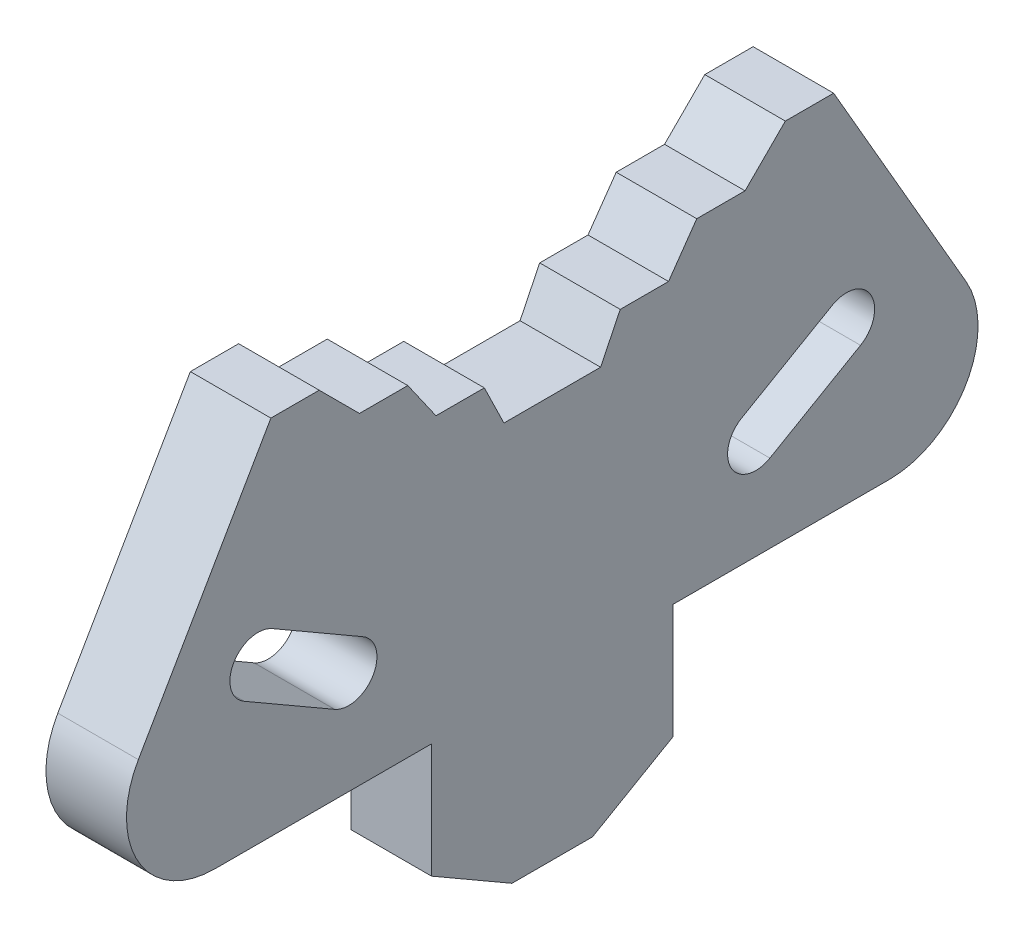
ISO-10303-21;
HEADER;
FILE_DESCRIPTION(('STEP AP214'),'2;1');
FILE_NAME('part.step','',(''),(''),'','','');
FILE_SCHEMA(('AUTOMOTIVE_DESIGN { 1 0 10303 214 1 1 1 1 }'));
ENDSEC;
DATA;
#1=APPLICATION_CONTEXT('core data for automotive mechanical design processes');
#2=APPLICATION_PROTOCOL_DEFINITION('international standard','automotive_design',2000,#1);
#3=PRODUCT_CONTEXT('',#1,'mechanical');
#4=PRODUCT('Part','Part','',(#3));
#5=PRODUCT_RELATED_PRODUCT_CATEGORY('part','',(#4));
#6=PRODUCT_DEFINITION_FORMATION('','',#4);
#7=PRODUCT_DEFINITION_CONTEXT('part definition',#1,'design');
#8=PRODUCT_DEFINITION('design','',#6,#7);
#9=PRODUCT_DEFINITION_SHAPE('','',#8);
#10=(LENGTH_UNIT() NAMED_UNIT(*) SI_UNIT(.MILLI.,.METRE.));
#11=(NAMED_UNIT(*) PLANE_ANGLE_UNIT() SI_UNIT($,.RADIAN.));
#12=(NAMED_UNIT(*) SI_UNIT($,.STERADIAN.) SOLID_ANGLE_UNIT());
#13=UNCERTAINTY_MEASURE_WITH_UNIT(LENGTH_MEASURE(1.E-05),#10,'distance_accuracy_value','');
#14=(GEOMETRIC_REPRESENTATION_CONTEXT(3) GLOBAL_UNCERTAINTY_ASSIGNED_CONTEXT((#13)) GLOBAL_UNIT_ASSIGNED_CONTEXT((#10,
#11,#12)) REPRESENTATION_CONTEXT('',''));
#15=CARTESIAN_POINT('',(0.,0.,0.));
#16=DIRECTION('',(0.,0.,1.));
#17=DIRECTION('',(1.,0.,0.));
#18=AXIS2_PLACEMENT_3D('',#15,#16,#17);
#19=CARTESIAN_POINT('',(10.,0.,0.));
#20=DIRECTION('',(0.,1.,0.));
#21=DIRECTION('',(0.,0.,1.));
#22=AXIS2_PLACEMENT_3D('',#19,#20,#21);
#23=PLANE('',#22);
#24=DIRECTION('',(0.,0.,-1.));
#25=VECTOR('',#24,1.);
#26=CARTESIAN_POINT('',(10.,0.,0.));
#27=LINE('',#26,#25);
#28=CARTESIAN_POINT('',(10.,0.,-15.));
#29=VERTEX_POINT('',#28);
#30=CARTESIAN_POINT('',(10.,0.,-41.8679038641535));
#31=VERTEX_POINT('',#30);
#32=EDGE_CURVE('E263',#29,#31,#27,.T.);
#33=ORIENTED_EDGE('',*,*,#32,.F.);
#34=DIRECTION('',(1.,0.,0.));
#35=VECTOR('',#34,1.);
#36=CARTESIAN_POINT('',(-36.0555127546399,0.,-15.));
#37=LINE('',#36,#35);
#38=CARTESIAN_POINT('',(0.,0.,-15.));
#39=VERTEX_POINT('',#38);
#40=EDGE_CURVE('E262',#39,#29,#37,.T.);
#41=ORIENTED_EDGE('',*,*,#40,.F.);
#42=DIRECTION('',(0.,0.,-1.));
#43=VECTOR('',#42,1.);
#44=CARTESIAN_POINT('',(0.,0.,0.));
#45=LINE('',#44,#43);
#46=CARTESIAN_POINT('',(0.,0.,-41.8679038641535));
#47=VERTEX_POINT('',#46);
#48=EDGE_CURVE('E246',#39,#47,#45,.T.);
#49=ORIENTED_EDGE('',*,*,#48,.T.);
#50=DIRECTION('',(-1.,0.,0.));
#51=VECTOR('',#50,1.);
#52=CARTESIAN_POINT('',(10.,0.,-41.8679038641535));
#53=LINE('',#52,#51);
#54=EDGE_CURVE('E474',#31,#47,#53,.T.);
#55=ORIENTED_EDGE('',*,*,#54,.F.);
#56=EDGE_LOOP('',(#33,#41,#49,#55));
#57=FACE_BOUND('',#56,.T.);
#58=ADVANCED_FACE('F39',(#57),#23,.F.);
#59=CARTESIAN_POINT('',(10.,11.,-41.8679038641536));
#60=DIRECTION('',(1.,0.,0.));
#61=DIRECTION('',(0.,0.,-1.));
#62=AXIS2_PLACEMENT_3D('',#59,#60,#61);
#63=PLANE('',#62);
#64=DIRECTION('',(0.,0.,-1.));
#65=VECTOR('',#64,1.);
#66=CARTESIAN_POINT('',(10.,-20.,15.));
#67=LINE('',#66,#65);
#68=CARTESIAN_POINT('',(10.,-20.,4.99999999999995));
#69=VERTEX_POINT('',#68);
#70=CARTESIAN_POINT('',(10.,-20.,-4.99999999999994));
#71=VERTEX_POINT('',#70);
#72=EDGE_CURVE('E265',#69,#71,#67,.T.);
#73=ORIENTED_EDGE('',*,*,#72,.T.);
#74=DIRECTION('',(0.,-0.499999999999997,0.86602540378444));
#75=VECTOR('',#74,1.);
#76=CARTESIAN_POINT('',(10.,3.71427066531963,-46.074321656774));
#77=LINE('',#76,#75);
#78=CARTESIAN_POINT('',(10.,-14.2264973081038,-15.));
#79=VERTEX_POINT('',#78);
#80=EDGE_CURVE('E61',#71,#79,#77,.F.);
#81=ORIENTED_EDGE('',*,*,#80,.T.);
#82=DIRECTION('',(0.,1.,0.));
#83=VECTOR('',#82,1.);
#84=CARTESIAN_POINT('',(10.,-20.,-15.));
#85=LINE('',#84,#83);
#86=EDGE_CURVE('E278',#79,#29,#85,.T.);
#87=ORIENTED_EDGE('',*,*,#86,.T.);
#88=ORIENTED_EDGE('',*,*,#32,.T.);
#89=CARTESIAN_POINT('',(10.,11.,-41.8679038641536));
#90=DIRECTION('',(1.,0.,0.));
#91=DIRECTION('',(0.,0.,-1.));
#92=AXIS2_PLACEMENT_3D('',#89,#90,#91);
#93=CIRCLE('',#92,11.);
#94=CARTESIAN_POINT('',(10.,16.5000000000001,-51.3941833057823));
#95=VERTEX_POINT('',#94);
#96=EDGE_CURVE('E414',#31,#95,#93,.T.);
#97=ORIENTED_EDGE('',*,*,#96,.T.);
#98=DIRECTION('',(0.,0.866025403784437,0.500000000000002));
#99=VECTOR('',#98,1.);
#100=CARTESIAN_POINT('',(10.,16.5,-51.3941833057823));
#101=LINE('',#100,#99);
#102=CARTESIAN_POINT('',(10.,45.,-34.9397006338779));
#103=VERTEX_POINT('',#102);
#104=EDGE_CURVE('E416',#95,#103,#101,.T.);
#105=ORIENTED_EDGE('',*,*,#104,.T.);
#106=DIRECTION('',(0.,0.,1.));
#107=VECTOR('',#106,1.);
#108=CARTESIAN_POINT('',(10.,45.,-34.9397006338779));
#109=LINE('',#108,#107);
#110=CARTESIAN_POINT('',(10.,45.,-28.9397006338779));
#111=VERTEX_POINT('',#110);
#112=EDGE_CURVE('E418',#103,#111,#109,.T.);
#113=ORIENTED_EDGE('',*,*,#112,.T.);
#114=DIRECTION('',(0.,-0.707106781186547,0.707106781186548));
#115=VECTOR('',#114,1.);
#116=CARTESIAN_POINT('',(10.,45.,-28.9397006338779));
#117=LINE('',#116,#115);
#118=CARTESIAN_POINT('',(10.,40.,-23.9397006338779));
#119=VERTEX_POINT('',#118);
#120=EDGE_CURVE('E420',#111,#119,#117,.T.);
#121=ORIENTED_EDGE('',*,*,#120,.T.);
#122=DIRECTION('',(0.,0.,1.));
#123=VECTOR('',#122,1.);
#124=CARTESIAN_POINT('',(10.,40.,-23.9397006338779));
#125=LINE('',#124,#123);
#126=CARTESIAN_POINT('',(10.,40.,-17.9397006338779));
#127=VERTEX_POINT('',#126);
#128=EDGE_CURVE('E422',#119,#127,#125,.T.);
#129=ORIENTED_EDGE('',*,*,#128,.T.);
#130=DIRECTION('',(0.,-0.819152044288991,0.573576436351047));
#131=VECTOR('',#130,1.);
#132=CARTESIAN_POINT('',(10.,40.,-17.9397006338779));
#133=LINE('',#132,#131);
#134=CARTESIAN_POINT('',(10.,35.,-14.4386629428293));
#135=VERTEX_POINT('',#134);
#136=EDGE_CURVE('E424',#127,#135,#133,.T.);
#137=ORIENTED_EDGE('',*,*,#136,.T.);
#138=DIRECTION('',(0.,0.,1.));
#139=VECTOR('',#138,1.);
#140=CARTESIAN_POINT('',(10.,35.,-14.4386629428293));
#141=LINE('',#140,#139);
#142=CARTESIAN_POINT('',(10.,35.,-8.43866294282931));
#143=VERTEX_POINT('',#142);
#144=EDGE_CURVE('E426',#135,#143,#141,.T.);
#145=ORIENTED_EDGE('',*,*,#144,.T.);
#146=DIRECTION('',(0.,-0.898794046299167,0.438371146789078));
#147=VECTOR('',#146,1.);
#148=CARTESIAN_POINT('',(10.,35.,-8.43866294282931));
#149=LINE('',#148,#147);
#150=CARTESIAN_POINT('',(10.,30.,-6.));
#151=VERTEX_POINT('',#150);
#152=EDGE_CURVE('E428',#143,#151,#149,.T.);
#153=ORIENTED_EDGE('',*,*,#152,.T.);
#154=DIRECTION('',(0.,0.,1.));
#155=VECTOR('',#154,1.);
#156=CARTESIAN_POINT('',(10.,30.,-6.));
#157=LINE('',#156,#155);
#158=CARTESIAN_POINT('',(10.,30.,6.));
#159=VERTEX_POINT('',#158);
#160=EDGE_CURVE('E430',#151,#159,#157,.T.);
#161=ORIENTED_EDGE('',*,*,#160,.T.);
#162=DIRECTION('',(0.,-0.898794046299167,-0.438371146789078));
#163=VECTOR('',#162,1.);
#164=CARTESIAN_POINT('',(10.,35.,8.43866294282931));
#165=LINE('',#164,#163);
#166=CARTESIAN_POINT('',(10.,35.,8.43866294282931));
#167=VERTEX_POINT('',#166);
#168=EDGE_CURVE('E336',#167,#159,#165,.T.);
#169=ORIENTED_EDGE('',*,*,#168,.F.);
#170=DIRECTION('',(0.,0.,-1.));
#171=VECTOR('',#170,1.);
#172=CARTESIAN_POINT('',(10.,35.,14.4386629428293));
#173=LINE('',#172,#171);
#174=CARTESIAN_POINT('',(10.,35.,14.4386629428293));
#175=VERTEX_POINT('',#174);
#176=EDGE_CURVE('E333',#175,#167,#173,.T.);
#177=ORIENTED_EDGE('',*,*,#176,.F.);
#178=DIRECTION('',(0.,-0.819152044288991,-0.573576436351047));
#179=VECTOR('',#178,1.);
#180=CARTESIAN_POINT('',(10.,40.,17.9397006338779));
#181=LINE('',#180,#179);
#182=CARTESIAN_POINT('',(10.,40.,17.9397006338779));
#183=VERTEX_POINT('',#182);
#184=EDGE_CURVE('E330',#183,#175,#181,.T.);
#185=ORIENTED_EDGE('',*,*,#184,.F.);
#186=DIRECTION('',(0.,0.,-1.));
#187=VECTOR('',#186,1.);
#188=CARTESIAN_POINT('',(10.,40.,23.9397006338779));
#189=LINE('',#188,#187);
#190=CARTESIAN_POINT('',(10.,40.,23.9397006338779));
#191=VERTEX_POINT('',#190);
#192=EDGE_CURVE('E327',#191,#183,#189,.T.);
#193=ORIENTED_EDGE('',*,*,#192,.F.);
#194=DIRECTION('',(0.,-0.707106781186547,-0.707106781186548));
#195=VECTOR('',#194,1.);
#196=CARTESIAN_POINT('',(10.,45.,28.9397006338779));
#197=LINE('',#196,#195);
#198=CARTESIAN_POINT('',(10.,45.,28.9397006338779));
#199=VERTEX_POINT('',#198);
#200=EDGE_CURVE('E324',#199,#191,#197,.T.);
#201=ORIENTED_EDGE('',*,*,#200,.F.);
#202=DIRECTION('',(0.,0.,-1.));
#203=VECTOR('',#202,1.);
#204=CARTESIAN_POINT('',(10.,45.,34.9397006338779));
#205=LINE('',#204,#203);
#206=CARTESIAN_POINT('',(10.,45.,34.9397006338779));
#207=VERTEX_POINT('',#206);
#208=EDGE_CURVE('E321',#207,#199,#205,.T.);
#209=ORIENTED_EDGE('',*,*,#208,.F.);
#210=DIRECTION('',(0.,0.866025403784437,-0.500000000000002));
#211=VECTOR('',#210,1.);
#212=CARTESIAN_POINT('',(10.,16.5,51.3941833057823));
#213=LINE('',#212,#211);
#214=CARTESIAN_POINT('',(10.,16.5000000000001,51.3941833057823));
#215=VERTEX_POINT('',#214);
#216=EDGE_CURVE('E317',#215,#207,#213,.T.);
#217=ORIENTED_EDGE('',*,*,#216,.F.);
#218=CARTESIAN_POINT('',(10.,11.,41.8679038641536));
#219=DIRECTION('',(-1.,0.,0.));
#220=DIRECTION('',(0.,0.,1.));
#221=AXIS2_PLACEMENT_3D('',#218,#219,#220);
#222=CIRCLE('',#221,11.);
#223=CARTESIAN_POINT('',(10.,0.,41.8679038641535));
#224=VERTEX_POINT('',#223);
#225=EDGE_CURVE('E314',#224,#215,#222,.T.);
#226=ORIENTED_EDGE('',*,*,#225,.F.);
#227=CARTESIAN_POINT('',(10.,0.,15.));
#228=VERTEX_POINT('',#227);
#229=EDGE_CURVE('E411',#224,#228,#27,.T.);
#230=ORIENTED_EDGE('',*,*,#229,.T.);
#231=DIRECTION('',(0.,-1.,0.));
#232=VECTOR('',#231,1.);
#233=CARTESIAN_POINT('',(10.,-20.,15.));
#234=LINE('',#233,#232);
#235=CARTESIAN_POINT('',(10.,-14.2264973081037,15.));
#236=VERTEX_POINT('',#235);
#237=EDGE_CURVE('E280',#228,#236,#234,.T.);
#238=ORIENTED_EDGE('',*,*,#237,.T.);
#239=DIRECTION('',(0.,0.499999999999998,0.86602540378444));
#240=VECTOR('',#239,1.);
#241=CARTESIAN_POINT('',(10.,-32.5443976842419,-16.7275341394566));
#242=LINE('',#241,#240);
#243=EDGE_CURVE('E479',#236,#69,#242,.F.);
#244=ORIENTED_EDGE('',*,*,#243,.T.);
#245=EDGE_LOOP('',(#73,#81,#87,#88,#97,#105,#113,#121,#129,#137,#145,#153,#161,#169,#177,#185,
#193,#201,#209,#217,#226,#230,#238,#244));
#246=FACE_BOUND('',#245,.T.);
#247=DIRECTION('',(0.,0.500000000000004,-0.866025403784436));
#248=VECTOR('',#247,1.);
#249=CARTESIAN_POINT('',(10.,9.71891108675445,-27.0190836249517));
#250=LINE('',#249,#248);
#251=CARTESIAN_POINT('',(10.,9.71891108675445,-27.0190836249517));
#252=VERTEX_POINT('',#251);
#253=CARTESIAN_POINT('',(10.,16.2189110867545,-38.2774138741494));
#254=VERTEX_POINT('',#253);
#255=EDGE_CURVE('E384',#252,#254,#250,.T.);
#256=ORIENTED_EDGE('',*,*,#255,.F.);
#257=CARTESIAN_POINT('',(10.,12.75,-25.2690836249517));
#258=DIRECTION('',(1.,0.,0.));
#259=DIRECTION('',(0.,0.,-1.));
#260=AXIS2_PLACEMENT_3D('',#257,#258,#259);
#261=CIRCLE('',#260,3.50000000000002);
#262=CARTESIAN_POINT('',(10.,15.7810889132455,-23.5190836249516));
#263=VERTEX_POINT('',#262);
#264=EDGE_CURVE('E382',#263,#252,#261,.T.);
#265=ORIENTED_EDGE('',*,*,#264,.F.);
#266=DIRECTION('',(0.,-0.500000000000001,0.866025403784438));
#267=VECTOR('',#266,1.);
#268=CARTESIAN_POINT('',(10.,15.7810889132455,-23.5190836249516));
#269=LINE('',#268,#267);
#270=CARTESIAN_POINT('',(10.,22.2810889132455,-34.7774138741494));
#271=VERTEX_POINT('',#270);
#272=EDGE_CURVE('E390',#271,#263,#269,.T.);
#273=ORIENTED_EDGE('',*,*,#272,.F.);
#274=CARTESIAN_POINT('',(10.,19.25,-36.5274138741494));
#275=DIRECTION('',(1.,0.,0.));
#276=DIRECTION('',(0.,0.,-1.));
#277=AXIS2_PLACEMENT_3D('',#274,#275,#276);
#278=CIRCLE('',#277,3.5);
#279=EDGE_CURVE('E387',#254,#271,#278,.T.);
#280=ORIENTED_EDGE('',*,*,#279,.F.);
#281=EDGE_LOOP('',(#256,#265,#273,#280));
#282=FACE_BOUND('',#281,.T.);
#283=DIRECTION('',(0.,0.500000000000004,0.866025403784436));
#284=VECTOR('',#283,1.);
#285=CARTESIAN_POINT('',(10.,9.71891108675445,27.0190836249517));
#286=LINE('',#285,#284);
#287=CARTESIAN_POINT('',(10.,9.71891108675445,27.0190836249517));
#288=VERTEX_POINT('',#287);
#289=CARTESIAN_POINT('',(10.,16.2189110867545,38.2774138741494));
#290=VERTEX_POINT('',#289);
#291=EDGE_CURVE('E288',#288,#290,#286,.T.);
#292=ORIENTED_EDGE('',*,*,#291,.T.);
#293=CARTESIAN_POINT('',(10.,19.25,36.5274138741494));
#294=DIRECTION('',(-1.,0.,0.));
#295=DIRECTION('',(0.,0.,1.));
#296=AXIS2_PLACEMENT_3D('',#293,#294,#295);
#297=CIRCLE('',#296,3.5);
#298=CARTESIAN_POINT('',(10.,22.2810889132455,34.7774138741494));
#299=VERTEX_POINT('',#298);
#300=EDGE_CURVE('E292',#290,#299,#297,.T.);
#301=ORIENTED_EDGE('',*,*,#300,.T.);
#302=DIRECTION('',(0.,-0.500000000000001,-0.866025403784438));
#303=VECTOR('',#302,1.);
#304=CARTESIAN_POINT('',(10.,15.7810889132455,23.5190836249516));
#305=LINE('',#304,#303);
#306=CARTESIAN_POINT('',(10.,15.7810889132455,23.5190836249516));
#307=VERTEX_POINT('',#306);
#308=EDGE_CURVE('E295',#299,#307,#305,.T.);
#309=ORIENTED_EDGE('',*,*,#308,.T.);
#310=CARTESIAN_POINT('',(10.,12.75,25.2690836249517));
#311=DIRECTION('',(-1.,0.,0.));
#312=DIRECTION('',(0.,0.,1.));
#313=AXIS2_PLACEMENT_3D('',#310,#311,#312);
#314=CIRCLE('',#313,3.50000000000002);
#315=EDGE_CURVE('E285',#307,#288,#314,.T.);
#316=ORIENTED_EDGE('',*,*,#315,.T.);
#317=EDGE_LOOP('',(#292,#301,#309,#316));
#318=FACE_BOUND('',#317,.T.);
#319=ADVANCED_FACE('F496',(#246,#282,#318),#63,.T.);
#320=CARTESIAN_POINT('',(0.,11.,-41.8679038641536));
#321=DIRECTION('',(1.,0.,0.));
#322=DIRECTION('',(0.,0.,-1.));
#323=AXIS2_PLACEMENT_3D('',#320,#321,#322);
#324=PLANE('',#323);
#325=DIRECTION('',(0.,-1.,0.));
#326=VECTOR('',#325,1.);
#327=CARTESIAN_POINT('',(0.,-20.,-15.));
#328=LINE('',#327,#326);
#329=CARTESIAN_POINT('',(0.,-14.2264973081038,-15.));
#330=VERTEX_POINT('',#329);
#331=EDGE_CURVE('E250',#39,#330,#328,.T.);
#332=ORIENTED_EDGE('',*,*,#331,.T.);
#333=DIRECTION('',(0.,0.499999999999997,-0.86602540378444));
#334=VECTOR('',#333,1.);
#335=CARTESIAN_POINT('',(0.,-20.,-4.99999999999995));
#336=LINE('',#335,#334);
#337=CARTESIAN_POINT('',(0.,-20.,-4.99999999999995));
#338=VERTEX_POINT('',#337);
#339=EDGE_CURVE('E11',#330,#338,#336,.F.);
#340=ORIENTED_EDGE('',*,*,#339,.T.);
#341=DIRECTION('',(0.,0.,1.));
#342=VECTOR('',#341,1.);
#343=CARTESIAN_POINT('',(0.,-20.,15.));
#344=LINE('',#343,#342);
#345=CARTESIAN_POINT('',(0.,-20.,4.99999999999995));
#346=VERTEX_POINT('',#345);
#347=EDGE_CURVE('E269',#338,#346,#344,.T.);
#348=ORIENTED_EDGE('',*,*,#347,.T.);
#349=DIRECTION('',(0.,-0.499999999999998,-0.86602540378444));
#350=VECTOR('',#349,1.);
#351=CARTESIAN_POINT('',(0.,-14.2264973081038,15.));
#352=LINE('',#351,#350);
#353=CARTESIAN_POINT('',(0.,-14.2264973081038,15.));
#354=VERTEX_POINT('',#353);
#355=EDGE_CURVE('E484',#346,#354,#352,.F.);
#356=ORIENTED_EDGE('',*,*,#355,.T.);
#357=DIRECTION('',(0.,1.,0.));
#358=VECTOR('',#357,1.);
#359=CARTESIAN_POINT('',(0.,-20.,15.));
#360=LINE('',#359,#358);
#361=CARTESIAN_POINT('',(0.,0.,15.));
#362=VERTEX_POINT('',#361);
#363=EDGE_CURVE('E274',#354,#362,#360,.T.);
#364=ORIENTED_EDGE('',*,*,#363,.T.);
#365=CARTESIAN_POINT('',(0.,0.,41.8679038641535));
#366=VERTEX_POINT('',#365);
#367=EDGE_CURVE('E257',#366,#362,#45,.T.);
#368=ORIENTED_EDGE('',*,*,#367,.F.);
#369=CARTESIAN_POINT('',(0.,11.,41.8679038641536));
#370=DIRECTION('',(-1.,0.,0.));
#371=DIRECTION('',(0.,0.,1.));
#372=AXIS2_PLACEMENT_3D('',#369,#370,#371);
#373=CIRCLE('',#372,11.);
#374=CARTESIAN_POINT('',(0.,16.5000000000001,51.3941833057823));
#375=VERTEX_POINT('',#374);
#376=EDGE_CURVE('E313',#366,#375,#373,.T.);
#377=ORIENTED_EDGE('',*,*,#376,.T.);
#378=DIRECTION('',(0.,0.866025403784437,-0.500000000000002));
#379=VECTOR('',#378,1.);
#380=CARTESIAN_POINT('',(0.,16.5,51.3941833057823));
#381=LINE('',#380,#379);
#382=CARTESIAN_POINT('',(0.,45.,34.9397006338779));
#383=VERTEX_POINT('',#382);
#384=EDGE_CURVE('E342',#375,#383,#381,.T.);
#385=ORIENTED_EDGE('',*,*,#384,.T.);
#386=DIRECTION('',(0.,0.,-1.));
#387=VECTOR('',#386,1.);
#388=CARTESIAN_POINT('',(0.,45.,34.9397006338779));
#389=LINE('',#388,#387);
#390=CARTESIAN_POINT('',(0.,45.,28.9397006338779));
#391=VERTEX_POINT('',#390);
#392=EDGE_CURVE('E345',#383,#391,#389,.T.);
#393=ORIENTED_EDGE('',*,*,#392,.T.);
#394=DIRECTION('',(0.,-0.707106781186547,-0.707106781186548));
#395=VECTOR('',#394,1.);
#396=CARTESIAN_POINT('',(0.,45.,28.9397006338779));
#397=LINE('',#396,#395);
#398=CARTESIAN_POINT('',(0.,40.,23.9397006338779));
#399=VERTEX_POINT('',#398);
#400=EDGE_CURVE('E348',#391,#399,#397,.T.);
#401=ORIENTED_EDGE('',*,*,#400,.T.);
#402=DIRECTION('',(0.,0.,-1.));
#403=VECTOR('',#402,1.);
#404=CARTESIAN_POINT('',(0.,40.,23.9397006338779));
#405=LINE('',#404,#403);
#406=CARTESIAN_POINT('',(0.,40.,17.9397006338779));
#407=VERTEX_POINT('',#406);
#408=EDGE_CURVE('E351',#399,#407,#405,.T.);
#409=ORIENTED_EDGE('',*,*,#408,.T.);
#410=DIRECTION('',(0.,-0.819152044288991,-0.573576436351047));
#411=VECTOR('',#410,1.);
#412=CARTESIAN_POINT('',(0.,40.,17.9397006338779));
#413=LINE('',#412,#411);
#414=CARTESIAN_POINT('',(0.,35.,14.4386629428293));
#415=VERTEX_POINT('',#414);
#416=EDGE_CURVE('E354',#407,#415,#413,.T.);
#417=ORIENTED_EDGE('',*,*,#416,.T.);
#418=DIRECTION('',(0.,0.,-1.));
#419=VECTOR('',#418,1.);
#420=CARTESIAN_POINT('',(0.,35.,14.4386629428293));
#421=LINE('',#420,#419);
#422=CARTESIAN_POINT('',(0.,35.,8.43866294282931));
#423=VERTEX_POINT('',#422);
#424=EDGE_CURVE('E357',#415,#423,#421,.T.);
#425=ORIENTED_EDGE('',*,*,#424,.T.);
#426=DIRECTION('',(0.,-0.898794046299167,-0.438371146789078));
#427=VECTOR('',#426,1.);
#428=CARTESIAN_POINT('',(0.,35.,8.43866294282931));
#429=LINE('',#428,#427);
#430=CARTESIAN_POINT('',(0.,30.,6.));
#431=VERTEX_POINT('',#430);
#432=EDGE_CURVE('E318',#423,#431,#429,.T.);
#433=ORIENTED_EDGE('',*,*,#432,.T.);
#434=DIRECTION('',(0.,0.,1.));
#435=VECTOR('',#434,1.);
#436=CARTESIAN_POINT('',(0.,30.,-6.));
#437=LINE('',#436,#435);
#438=CARTESIAN_POINT('',(0.,30.,-6.));
#439=VERTEX_POINT('',#438);
#440=EDGE_CURVE('E449',#439,#431,#437,.T.);
#441=ORIENTED_EDGE('',*,*,#440,.F.);
#442=DIRECTION('',(0.,-0.898794046299167,0.438371146789078));
#443=VECTOR('',#442,1.);
#444=CARTESIAN_POINT('',(0.,35.,-8.43866294282931));
#445=LINE('',#444,#443);
#446=CARTESIAN_POINT('',(0.,35.,-8.43866294282931));
#447=VERTEX_POINT('',#446);
#448=EDGE_CURVE('E447',#447,#439,#445,.T.);
#449=ORIENTED_EDGE('',*,*,#448,.F.);
#450=DIRECTION('',(0.,0.,1.));
#451=VECTOR('',#450,1.);
#452=CARTESIAN_POINT('',(0.,35.,-14.4386629428293));
#453=LINE('',#452,#451);
#454=CARTESIAN_POINT('',(0.,35.,-14.4386629428293));
#455=VERTEX_POINT('',#454);
#456=EDGE_CURVE('E445',#455,#447,#453,.T.);
#457=ORIENTED_EDGE('',*,*,#456,.F.);
#458=DIRECTION('',(0.,-0.819152044288991,0.573576436351047));
#459=VECTOR('',#458,1.);
#460=CARTESIAN_POINT('',(0.,40.,-17.9397006338779));
#461=LINE('',#460,#459);
#462=CARTESIAN_POINT('',(0.,40.,-17.9397006338779));
#463=VERTEX_POINT('',#462);
#464=EDGE_CURVE('E443',#463,#455,#461,.T.);
#465=ORIENTED_EDGE('',*,*,#464,.F.);
#466=DIRECTION('',(0.,0.,1.));
#467=VECTOR('',#466,1.);
#468=CARTESIAN_POINT('',(0.,40.,-23.9397006338779));
#469=LINE('',#468,#467);
#470=CARTESIAN_POINT('',(0.,40.,-23.9397006338779));
#471=VERTEX_POINT('',#470);
#472=EDGE_CURVE('E441',#471,#463,#469,.T.);
#473=ORIENTED_EDGE('',*,*,#472,.F.);
#474=DIRECTION('',(0.,-0.707106781186547,0.707106781186548));
#475=VECTOR('',#474,1.);
#476=CARTESIAN_POINT('',(0.,45.,-28.9397006338779));
#477=LINE('',#476,#475);
#478=CARTESIAN_POINT('',(0.,45.,-28.9397006338779));
#479=VERTEX_POINT('',#478);
#480=EDGE_CURVE('E439',#479,#471,#477,.T.);
#481=ORIENTED_EDGE('',*,*,#480,.F.);
#482=DIRECTION('',(0.,0.,1.));
#483=VECTOR('',#482,1.);
#484=CARTESIAN_POINT('',(0.,45.,-34.9397006338779));
#485=LINE('',#484,#483);
#486=CARTESIAN_POINT('',(0.,45.,-34.9397006338779));
#487=VERTEX_POINT('',#486);
#488=EDGE_CURVE('E437',#487,#479,#485,.T.);
#489=ORIENTED_EDGE('',*,*,#488,.F.);
#490=DIRECTION('',(0.,0.866025403784437,0.500000000000002));
#491=VECTOR('',#490,1.);
#492=CARTESIAN_POINT('',(0.,16.5,-51.3941833057823));
#493=LINE('',#492,#491);
#494=CARTESIAN_POINT('',(0.,16.5000000000001,-51.3941833057823));
#495=VERTEX_POINT('',#494);
#496=EDGE_CURVE('E435',#495,#487,#493,.T.);
#497=ORIENTED_EDGE('',*,*,#496,.F.);
#498=CARTESIAN_POINT('',(0.,11.,-41.8679038641536));
#499=DIRECTION('',(1.,0.,0.));
#500=DIRECTION('',(0.,0.,-1.));
#501=AXIS2_PLACEMENT_3D('',#498,#499,#500);
#502=CIRCLE('',#501,11.);
#503=EDGE_CURVE('E253',#47,#495,#502,.T.);
#504=ORIENTED_EDGE('',*,*,#503,.F.);
#505=ORIENTED_EDGE('',*,*,#48,.F.);
#506=EDGE_LOOP('',(#332,#340,#348,#356,#364,#368,#377,#385,#393,#401,#409,#417,#425,#433,#441,
#449,#457,#465,#473,#481,#489,#497,#504,#505));
#507=FACE_BOUND('',#506,.T.);
#508=CARTESIAN_POINT('',(0.,12.75,-25.2690836249517));
#509=DIRECTION('',(1.,0.,0.));
#510=DIRECTION('',(0.,0.,-1.));
#511=AXIS2_PLACEMENT_3D('',#508,#509,#510);
#512=CIRCLE('',#511,3.50000000000002);
#513=CARTESIAN_POINT('',(0.,15.7810889132455,-23.5190836249516));
#514=VERTEX_POINT('',#513);
#515=CARTESIAN_POINT('',(0.,9.71891108675445,-27.0190836249517));
#516=VERTEX_POINT('',#515);
#517=EDGE_CURVE('E381',#514,#516,#512,.T.);
#518=ORIENTED_EDGE('',*,*,#517,.T.);
#519=DIRECTION('',(0.,0.500000000000004,-0.866025403784436));
#520=VECTOR('',#519,1.);
#521=CARTESIAN_POINT('',(0.,9.71891108675445,-27.0190836249517));
#522=LINE('',#521,#520);
#523=CARTESIAN_POINT('',(0.,16.2189110867545,-38.2774138741494));
#524=VERTEX_POINT('',#523);
#525=EDGE_CURVE('E395',#516,#524,#522,.T.);
#526=ORIENTED_EDGE('',*,*,#525,.T.);
#527=CARTESIAN_POINT('',(0.,19.25,-36.5274138741494));
#528=DIRECTION('',(1.,0.,0.));
#529=DIRECTION('',(0.,0.,-1.));
#530=AXIS2_PLACEMENT_3D('',#527,#528,#529);
#531=CIRCLE('',#530,3.5);
#532=CARTESIAN_POINT('',(0.,22.2810889132455,-34.7774138741494));
#533=VERTEX_POINT('',#532);
#534=EDGE_CURVE('E398',#524,#533,#531,.T.);
#535=ORIENTED_EDGE('',*,*,#534,.T.);
#536=DIRECTION('',(0.,-0.500000000000001,0.866025403784438));
#537=VECTOR('',#536,1.);
#538=CARTESIAN_POINT('',(0.,15.7810889132455,-23.5190836249516));
#539=LINE('',#538,#537);
#540=EDGE_CURVE('E385',#533,#514,#539,.T.);
#541=ORIENTED_EDGE('',*,*,#540,.T.);
#542=EDGE_LOOP('',(#518,#526,#535,#541));
#543=FACE_BOUND('',#542,.T.);
#544=CARTESIAN_POINT('',(0.,12.75,25.2690836249517));
#545=DIRECTION('',(-1.,0.,0.));
#546=DIRECTION('',(0.,0.,1.));
#547=AXIS2_PLACEMENT_3D('',#544,#545,#546);
#548=CIRCLE('',#547,3.50000000000002);
#549=CARTESIAN_POINT('',(0.,15.7810889132455,23.5190836249516));
#550=VERTEX_POINT('',#549);
#551=CARTESIAN_POINT('',(0.,9.71891108675445,27.0190836249517));
#552=VERTEX_POINT('',#551);
#553=EDGE_CURVE('E268',#550,#552,#548,.T.);
#554=ORIENTED_EDGE('',*,*,#553,.F.);
#555=DIRECTION('',(0.,-0.500000000000001,-0.866025403784438));
#556=VECTOR('',#555,1.);
#557=CARTESIAN_POINT('',(0.,15.7810889132455,23.5190836249516));
#558=LINE('',#557,#556);
#559=CARTESIAN_POINT('',(0.,22.2810889132455,34.7774138741494));
#560=VERTEX_POINT('',#559);
#561=EDGE_CURVE('E289',#560,#550,#558,.T.);
#562=ORIENTED_EDGE('',*,*,#561,.F.);
#563=CARTESIAN_POINT('',(0.,19.25,36.5274138741494));
#564=DIRECTION('',(-1.,0.,0.));
#565=DIRECTION('',(0.,0.,1.));
#566=AXIS2_PLACEMENT_3D('',#563,#564,#565);
#567=CIRCLE('',#566,3.5);
#568=CARTESIAN_POINT('',(0.,16.2189110867545,38.2774138741494));
#569=VERTEX_POINT('',#568);
#570=EDGE_CURVE('E301',#569,#560,#567,.T.);
#571=ORIENTED_EDGE('',*,*,#570,.F.);
#572=DIRECTION('',(0.,0.500000000000004,0.866025403784436));
#573=VECTOR('',#572,1.);
#574=CARTESIAN_POINT('',(0.,9.71891108675445,27.0190836249517));
#575=LINE('',#574,#573);
#576=EDGE_CURVE('E272',#552,#569,#575,.T.);
#577=ORIENTED_EDGE('',*,*,#576,.F.);
#578=EDGE_LOOP('',(#554,#562,#571,#577));
#579=FACE_BOUND('',#578,.T.);
#580=ADVANCED_FACE('F248',(#507,#543,#579),#324,.F.);
#581=ORIENTED_EDGE('',*,*,#367,.T.);
#582=DIRECTION('',(1.,0.,0.));
#583=VECTOR('',#582,1.);
#584=CARTESIAN_POINT('',(-36.0555127546399,0.,15.));
#585=LINE('',#584,#583);
#586=EDGE_CURVE('E264',#362,#228,#585,.T.);
#587=ORIENTED_EDGE('',*,*,#586,.T.);
#588=ORIENTED_EDGE('',*,*,#229,.F.);
#589=DIRECTION('',(-1.,0.,0.));
#590=VECTOR('',#589,1.);
#591=CARTESIAN_POINT('',(10.,0.,41.8679038641535));
#592=LINE('',#591,#590);
#593=EDGE_CURVE('E378',#224,#366,#592,.T.);
#594=ORIENTED_EDGE('',*,*,#593,.T.);
#595=EDGE_LOOP('',(#581,#587,#588,#594));
#596=FACE_BOUND('',#595,.T.);
#597=ADVANCED_FACE('F508',(#596),#23,.F.);
#598=CARTESIAN_POINT('',(10.,11.,-41.8679038641536));
#599=DIRECTION('',(-1.,0.,0.));
#600=DIRECTION('',(0.,0.,1.));
#601=AXIS2_PLACEMENT_3D('',#598,#599,#600);
#602=CYLINDRICAL_SURFACE('',#601,11.);
#603=ORIENTED_EDGE('',*,*,#503,.T.);
#604=DIRECTION('',(-1.,0.,0.));
#605=VECTOR('',#604,1.);
#606=CARTESIAN_POINT('',(10.,16.5000000000001,-51.3941833057823));
#607=LINE('',#606,#605);
#608=EDGE_CURVE('E471',#95,#495,#607,.T.);
#609=ORIENTED_EDGE('',*,*,#608,.F.);
#610=ORIENTED_EDGE('',*,*,#96,.F.);
#611=ORIENTED_EDGE('',*,*,#54,.T.);
#612=EDGE_LOOP('',(#603,#609,#610,#611));
#613=FACE_BOUND('',#612,.T.);
#614=ADVANCED_FACE('F584',(#613),#602,.T.);
#615=CARTESIAN_POINT('',(10.,16.5,-51.3941833057823));
#616=DIRECTION('',(0.,-0.500000000000002,0.866025403784437));
#617=DIRECTION('',(0.,-0.866025403784437,-0.500000000000002));
#618=AXIS2_PLACEMENT_3D('',#615,#616,#617);
#619=PLANE('',#618);
#620=ORIENTED_EDGE('',*,*,#496,.T.);
#621=DIRECTION('',(-1.,0.,0.));
#622=VECTOR('',#621,1.);
#623=CARTESIAN_POINT('',(10.,45.,-34.9397006338779));
#624=LINE('',#623,#622);
#625=EDGE_CURVE('E468',#103,#487,#624,.T.);
#626=ORIENTED_EDGE('',*,*,#625,.F.);
#627=ORIENTED_EDGE('',*,*,#104,.F.);
#628=ORIENTED_EDGE('',*,*,#608,.T.);
#629=EDGE_LOOP('',(#620,#626,#627,#628));
#630=FACE_BOUND('',#629,.T.);
#631=ADVANCED_FACE('F580',(#630),#619,.F.);
#632=CARTESIAN_POINT('',(10.,45.,-34.9397006338779));
#633=DIRECTION('',(0.,-1.,0.));
#634=DIRECTION('',(0.,0.,-1.));
#635=AXIS2_PLACEMENT_3D('',#632,#633,#634);
#636=PLANE('',#635);
#637=ORIENTED_EDGE('',*,*,#488,.T.);
#638=DIRECTION('',(-1.,0.,0.));
#639=VECTOR('',#638,1.);
#640=CARTESIAN_POINT('',(10.,45.,-28.9397006338779));
#641=LINE('',#640,#639);
#642=EDGE_CURVE('E465',#111,#479,#641,.T.);
#643=ORIENTED_EDGE('',*,*,#642,.F.);
#644=ORIENTED_EDGE('',*,*,#112,.F.);
#645=ORIENTED_EDGE('',*,*,#625,.T.);
#646=EDGE_LOOP('',(#637,#643,#644,#645));
#647=FACE_BOUND('',#646,.T.);
#648=ADVANCED_FACE('F576',(#647),#636,.F.);
#649=CARTESIAN_POINT('',(10.,45.,-28.9397006338779));
#650=DIRECTION('',(0.,-0.707106781186548,-0.707106781186547));
#651=DIRECTION('',(0.,0.707106781186547,-0.707106781186548));
#652=AXIS2_PLACEMENT_3D('',#649,#650,#651);
#653=PLANE('',#652);
#654=ORIENTED_EDGE('',*,*,#480,.T.);
#655=DIRECTION('',(-1.,0.,0.));
#656=VECTOR('',#655,1.);
#657=CARTESIAN_POINT('',(10.,40.,-23.9397006338779));
#658=LINE('',#657,#656);
#659=EDGE_CURVE('E462',#119,#471,#658,.T.);
#660=ORIENTED_EDGE('',*,*,#659,.F.);
#661=ORIENTED_EDGE('',*,*,#120,.F.);
#662=ORIENTED_EDGE('',*,*,#642,.T.);
#663=EDGE_LOOP('',(#654,#660,#661,#662));
#664=FACE_BOUND('',#663,.T.);
#665=ADVANCED_FACE('F571',(#664),#653,.F.);
#666=CARTESIAN_POINT('',(10.,40.,-23.9397006338779));
#667=DIRECTION('',(0.,-1.,0.));
#668=DIRECTION('',(0.,0.,-1.));
#669=AXIS2_PLACEMENT_3D('',#666,#667,#668);
#670=PLANE('',#669);
#671=ORIENTED_EDGE('',*,*,#472,.T.);
#672=DIRECTION('',(-1.,0.,0.));
#673=VECTOR('',#672,1.);
#674=CARTESIAN_POINT('',(10.,40.,-17.9397006338779));
#675=LINE('',#674,#673);
#676=EDGE_CURVE('E459',#127,#463,#675,.T.);
#677=ORIENTED_EDGE('',*,*,#676,.F.);
#678=ORIENTED_EDGE('',*,*,#128,.F.);
#679=ORIENTED_EDGE('',*,*,#659,.T.);
#680=EDGE_LOOP('',(#671,#677,#678,#679));
#681=FACE_BOUND('',#680,.T.);
#682=ADVANCED_FACE('F566',(#681),#670,.F.);
#683=CARTESIAN_POINT('',(10.,40.,-17.9397006338779));
#684=DIRECTION('',(0.,-0.573576436351047,-0.819152044288991));
#685=DIRECTION('',(0.,0.819152044288991,-0.573576436351047));
#686=AXIS2_PLACEMENT_3D('',#683,#684,#685);
#687=PLANE('',#686);
#688=ORIENTED_EDGE('',*,*,#464,.T.);
#689=DIRECTION('',(-1.,0.,0.));
#690=VECTOR('',#689,1.);
#691=CARTESIAN_POINT('',(10.,35.,-14.4386629428293));
#692=LINE('',#691,#690);
#693=EDGE_CURVE('E456',#135,#455,#692,.T.);
#694=ORIENTED_EDGE('',*,*,#693,.F.);
#695=ORIENTED_EDGE('',*,*,#136,.F.);
#696=ORIENTED_EDGE('',*,*,#676,.T.);
#697=EDGE_LOOP('',(#688,#694,#695,#696));
#698=FACE_BOUND('',#697,.T.);
#699=ADVANCED_FACE('F562',(#698),#687,.F.);
#700=CARTESIAN_POINT('',(10.,35.,-14.4386629428293));
#701=DIRECTION('',(0.,-1.,0.));
#702=DIRECTION('',(0.,0.,-1.));
#703=AXIS2_PLACEMENT_3D('',#700,#701,#702);
#704=PLANE('',#703);
#705=ORIENTED_EDGE('',*,*,#456,.T.);
#706=DIRECTION('',(-1.,0.,0.));
#707=VECTOR('',#706,1.);
#708=CARTESIAN_POINT('',(10.,35.,-8.43866294282931));
#709=LINE('',#708,#707);
#710=EDGE_CURVE('E453',#143,#447,#709,.T.);
#711=ORIENTED_EDGE('',*,*,#710,.F.);
#712=ORIENTED_EDGE('',*,*,#144,.F.);
#713=ORIENTED_EDGE('',*,*,#693,.T.);
#714=EDGE_LOOP('',(#705,#711,#712,#713));
#715=FACE_BOUND('',#714,.T.);
#716=ADVANCED_FACE('F557',(#715),#704,.F.);
#717=CARTESIAN_POINT('',(10.,35.,-8.43866294282931));
#718=DIRECTION('',(0.,-0.438371146789078,-0.898794046299167));
#719=DIRECTION('',(0.,0.898794046299167,-0.438371146789078));
#720=AXIS2_PLACEMENT_3D('',#717,#718,#719);
#721=PLANE('',#720);
#722=ORIENTED_EDGE('',*,*,#448,.T.);
#723=DIRECTION('',(-1.,0.,0.));
#724=VECTOR('',#723,1.);
#725=CARTESIAN_POINT('',(10.,30.,-6.));
#726=LINE('',#725,#724);
#727=EDGE_CURVE('E431',#151,#439,#726,.T.);
#728=ORIENTED_EDGE('',*,*,#727,.F.);
#729=ORIENTED_EDGE('',*,*,#152,.F.);
#730=ORIENTED_EDGE('',*,*,#710,.T.);
#731=EDGE_LOOP('',(#722,#728,#729,#730));
#732=FACE_BOUND('',#731,.T.);
#733=ADVANCED_FACE('F551',(#732),#721,.F.);
#734=CARTESIAN_POINT('',(10.,30.,-6.));
#735=DIRECTION('',(0.,-1.,0.));
#736=DIRECTION('',(0.,0.,-1.));
#737=AXIS2_PLACEMENT_3D('',#734,#735,#736);
#738=PLANE('',#737);
#739=ORIENTED_EDGE('',*,*,#440,.T.);
#740=DIRECTION('',(-1.,0.,0.));
#741=VECTOR('',#740,1.);
#742=CARTESIAN_POINT('',(10.,30.,6.));
#743=LINE('',#742,#741);
#744=EDGE_CURVE('E339',#159,#431,#743,.T.);
#745=ORIENTED_EDGE('',*,*,#744,.F.);
#746=ORIENTED_EDGE('',*,*,#160,.F.);
#747=ORIENTED_EDGE('',*,*,#727,.T.);
#748=EDGE_LOOP('',(#739,#745,#746,#747));
#749=FACE_BOUND('',#748,.T.);
#750=ADVANCED_FACE('F547',(#749),#738,.F.);
#751=CARTESIAN_POINT('',(10.,12.75,-25.2690836249517));
#752=DIRECTION('',(-1.,0.,0.));
#753=DIRECTION('',(0.,0.,1.));
#754=AXIS2_PLACEMENT_3D('',#751,#752,#753);
#755=CYLINDRICAL_SURFACE('',#754,3.50000000000002);
#756=ORIENTED_EDGE('',*,*,#517,.F.);
#757=DIRECTION('',(-1.,0.,0.));
#758=VECTOR('',#757,1.);
#759=CARTESIAN_POINT('',(10.,15.7810889132455,-23.5190836249516));
#760=LINE('',#759,#758);
#761=EDGE_CURVE('E392',#263,#514,#760,.T.);
#762=ORIENTED_EDGE('',*,*,#761,.F.);
#763=ORIENTED_EDGE('',*,*,#264,.T.);
#764=DIRECTION('',(-1.,0.,0.));
#765=VECTOR('',#764,1.);
#766=CARTESIAN_POINT('',(10.,9.71891108675445,-27.0190836249517));
#767=LINE('',#766,#765);
#768=EDGE_CURVE('E258',#252,#516,#767,.T.);
#769=ORIENTED_EDGE('',*,*,#768,.T.);
#770=EDGE_LOOP('',(#756,#762,#763,#769));
#771=FACE_BOUND('',#770,.T.);
#772=ADVANCED_FACE('F608',(#771),#755,.F.);
#773=CARTESIAN_POINT('',(10.,9.71891108675445,-27.0190836249517));
#774=DIRECTION('',(0.,0.866025403784436,0.500000000000004));
#775=DIRECTION('',(0.,-0.500000000000004,0.866025403784436));
#776=AXIS2_PLACEMENT_3D('',#773,#774,#775);
#777=PLANE('',#776);
#778=ORIENTED_EDGE('',*,*,#525,.F.);
#779=ORIENTED_EDGE('',*,*,#768,.F.);
#780=ORIENTED_EDGE('',*,*,#255,.T.);
#781=DIRECTION('',(-1.,0.,0.));
#782=VECTOR('',#781,1.);
#783=CARTESIAN_POINT('',(10.,16.2189110867545,-38.2774138741494));
#784=LINE('',#783,#782);
#785=EDGE_CURVE('E407',#254,#524,#784,.T.);
#786=ORIENTED_EDGE('',*,*,#785,.T.);
#787=EDGE_LOOP('',(#778,#779,#780,#786));
#788=FACE_BOUND('',#787,.T.);
#789=ADVANCED_FACE('F672',(#788),#777,.T.);
#790=CARTESIAN_POINT('',(10.,19.25,-36.5274138741494));
#791=DIRECTION('',(-1.,0.,0.));
#792=DIRECTION('',(0.,0.,1.));
#793=AXIS2_PLACEMENT_3D('',#790,#791,#792);
#794=CYLINDRICAL_SURFACE('',#793,3.5);
#795=ORIENTED_EDGE('',*,*,#534,.F.);
#796=ORIENTED_EDGE('',*,*,#785,.F.);
#797=ORIENTED_EDGE('',*,*,#279,.T.);
#798=DIRECTION('',(-1.,0.,0.));
#799=VECTOR('',#798,1.);
#800=CARTESIAN_POINT('',(10.,22.2810889132455,-34.7774138741494));
#801=LINE('',#800,#799);
#802=EDGE_CURVE('E405',#271,#533,#801,.T.);
#803=ORIENTED_EDGE('',*,*,#802,.T.);
#804=EDGE_LOOP('',(#795,#796,#797,#803));
#805=FACE_BOUND('',#804,.T.);
#806=ADVANCED_FACE('F680',(#805),#794,.F.);
#807=CARTESIAN_POINT('',(10.,15.7810889132455,-23.5190836249516));
#808=DIRECTION('',(0.,-0.866025403784438,-0.500000000000001));
#809=DIRECTION('',(0.,0.500000000000001,-0.866025403784438));
#810=AXIS2_PLACEMENT_3D('',#807,#808,#809);
#811=PLANE('',#810);
#812=ORIENTED_EDGE('',*,*,#540,.F.);
#813=ORIENTED_EDGE('',*,*,#802,.F.);
#814=ORIENTED_EDGE('',*,*,#272,.T.);
#815=ORIENTED_EDGE('',*,*,#761,.T.);
#816=EDGE_LOOP('',(#812,#813,#814,#815));
#817=FACE_BOUND('',#816,.T.);
#818=ADVANCED_FACE('F689',(#817),#811,.T.);
#819=CARTESIAN_POINT('',(10.,11.,41.8679038641536));
#820=DIRECTION('',(-1.,0.,0.));
#821=DIRECTION('',(0.,0.,-1.));
#822=AXIS2_PLACEMENT_3D('',#819,#820,#821);
#823=CYLINDRICAL_SURFACE('',#822,11.);
#824=ORIENTED_EDGE('',*,*,#376,.F.);
#825=ORIENTED_EDGE('',*,*,#593,.F.);
#826=ORIENTED_EDGE('',*,*,#225,.T.);
#827=DIRECTION('',(-1.,0.,0.));
#828=VECTOR('',#827,1.);
#829=CARTESIAN_POINT('',(10.,16.5000000000001,51.3941833057823));
#830=LINE('',#829,#828);
#831=EDGE_CURVE('E376',#215,#375,#830,.T.);
#832=ORIENTED_EDGE('',*,*,#831,.T.);
#833=EDGE_LOOP('',(#824,#825,#826,#832));
#834=FACE_BOUND('',#833,.T.);
#835=ADVANCED_FACE('F513',(#834),#823,.T.);
#836=CARTESIAN_POINT('',(10.,16.5,51.3941833057823));
#837=DIRECTION('',(0.,-0.500000000000002,-0.866025403784437));
#838=DIRECTION('',(0.,-0.866025403784437,0.500000000000002));
#839=AXIS2_PLACEMENT_3D('',#836,#837,#838);
#840=PLANE('',#839);
#841=ORIENTED_EDGE('',*,*,#384,.F.);
#842=ORIENTED_EDGE('',*,*,#831,.F.);
#843=ORIENTED_EDGE('',*,*,#216,.T.);
#844=DIRECTION('',(-1.,0.,0.));
#845=VECTOR('',#844,1.);
#846=CARTESIAN_POINT('',(10.,45.,34.9397006338779));
#847=LINE('',#846,#845);
#848=EDGE_CURVE('E374',#207,#383,#847,.T.);
#849=ORIENTED_EDGE('',*,*,#848,.T.);
#850=EDGE_LOOP('',(#841,#842,#843,#849));
#851=FACE_BOUND('',#850,.T.);
#852=ADVANCED_FACE('F517',(#851),#840,.F.);
#853=CARTESIAN_POINT('',(10.,45.,34.9397006338779));
#854=DIRECTION('',(0.,-1.,0.));
#855=DIRECTION('',(0.,0.,1.));
#856=AXIS2_PLACEMENT_3D('',#853,#854,#855);
#857=PLANE('',#856);
#858=ORIENTED_EDGE('',*,*,#392,.F.);
#859=ORIENTED_EDGE('',*,*,#848,.F.);
#860=ORIENTED_EDGE('',*,*,#208,.T.);
#861=DIRECTION('',(-1.,0.,0.));
#862=VECTOR('',#861,1.);
#863=CARTESIAN_POINT('',(10.,45.,28.9397006338779));
#864=LINE('',#863,#862);
#865=EDGE_CURVE('E372',#199,#391,#864,.T.);
#866=ORIENTED_EDGE('',*,*,#865,.T.);
#867=EDGE_LOOP('',(#858,#859,#860,#866));
#868=FACE_BOUND('',#867,.T.);
#869=ADVANCED_FACE('F521',(#868),#857,.F.);
#870=CARTESIAN_POINT('',(10.,45.,28.9397006338779));
#871=DIRECTION('',(0.,-0.707106781186548,0.707106781186547));
#872=DIRECTION('',(0.,0.707106781186547,0.707106781186548));
#873=AXIS2_PLACEMENT_3D('',#870,#871,#872);
#874=PLANE('',#873);
#875=ORIENTED_EDGE('',*,*,#400,.F.);
#876=ORIENTED_EDGE('',*,*,#865,.F.);
#877=ORIENTED_EDGE('',*,*,#200,.T.);
#878=DIRECTION('',(-1.,0.,0.));
#879=VECTOR('',#878,1.);
#880=CARTESIAN_POINT('',(10.,40.,23.9397006338779));
#881=LINE('',#880,#879);
#882=EDGE_CURVE('E370',#191,#399,#881,.T.);
#883=ORIENTED_EDGE('',*,*,#882,.T.);
#884=EDGE_LOOP('',(#875,#876,#877,#883));
#885=FACE_BOUND('',#884,.T.);
#886=ADVANCED_FACE('F525',(#885),#874,.F.);
#887=CARTESIAN_POINT('',(10.,40.,23.9397006338779));
#888=DIRECTION('',(0.,-1.,0.));
#889=DIRECTION('',(0.,0.,1.));
#890=AXIS2_PLACEMENT_3D('',#887,#888,#889);
#891=PLANE('',#890);
#892=ORIENTED_EDGE('',*,*,#408,.F.);
#893=ORIENTED_EDGE('',*,*,#882,.F.);
#894=ORIENTED_EDGE('',*,*,#192,.T.);
#895=DIRECTION('',(-1.,0.,0.));
#896=VECTOR('',#895,1.);
#897=CARTESIAN_POINT('',(10.,40.,17.9397006338779));
#898=LINE('',#897,#896);
#899=EDGE_CURVE('E368',#183,#407,#898,.T.);
#900=ORIENTED_EDGE('',*,*,#899,.T.);
#901=EDGE_LOOP('',(#892,#893,#894,#900));
#902=FACE_BOUND('',#901,.T.);
#903=ADVANCED_FACE('F529',(#902),#891,.F.);
#904=CARTESIAN_POINT('',(10.,40.,17.9397006338779));
#905=DIRECTION('',(0.,-0.573576436351047,0.819152044288991));
#906=DIRECTION('',(0.,0.819152044288991,0.573576436351047));
#907=AXIS2_PLACEMENT_3D('',#904,#905,#906);
#908=PLANE('',#907);
#909=ORIENTED_EDGE('',*,*,#416,.F.);
#910=ORIENTED_EDGE('',*,*,#899,.F.);
#911=ORIENTED_EDGE('',*,*,#184,.T.);
#912=DIRECTION('',(-1.,0.,0.));
#913=VECTOR('',#912,1.);
#914=CARTESIAN_POINT('',(10.,35.,14.4386629428293));
#915=LINE('',#914,#913);
#916=EDGE_CURVE('E366',#175,#415,#915,.T.);
#917=ORIENTED_EDGE('',*,*,#916,.T.);
#918=EDGE_LOOP('',(#909,#910,#911,#917));
#919=FACE_BOUND('',#918,.T.);
#920=ADVANCED_FACE('F533',(#919),#908,.F.);
#921=CARTESIAN_POINT('',(10.,35.,14.4386629428293));
#922=DIRECTION('',(0.,-1.,0.));
#923=DIRECTION('',(0.,0.,1.));
#924=AXIS2_PLACEMENT_3D('',#921,#922,#923);
#925=PLANE('',#924);
#926=ORIENTED_EDGE('',*,*,#424,.F.);
#927=ORIENTED_EDGE('',*,*,#916,.F.);
#928=ORIENTED_EDGE('',*,*,#176,.T.);
#929=DIRECTION('',(-1.,0.,0.));
#930=VECTOR('',#929,1.);
#931=CARTESIAN_POINT('',(10.,35.,8.43866294282931));
#932=LINE('',#931,#930);
#933=EDGE_CURVE('E364',#167,#423,#932,.T.);
#934=ORIENTED_EDGE('',*,*,#933,.T.);
#935=EDGE_LOOP('',(#926,#927,#928,#934));
#936=FACE_BOUND('',#935,.T.);
#937=ADVANCED_FACE('F537',(#936),#925,.F.);
#938=CARTESIAN_POINT('',(10.,35.,8.43866294282931));
#939=DIRECTION('',(0.,-0.438371146789078,0.898794046299167));
#940=DIRECTION('',(0.,0.898794046299167,0.438371146789078));
#941=AXIS2_PLACEMENT_3D('',#938,#939,#940);
#942=PLANE('',#941);
#943=ORIENTED_EDGE('',*,*,#432,.F.);
#944=ORIENTED_EDGE('',*,*,#933,.F.);
#945=ORIENTED_EDGE('',*,*,#168,.T.);
#946=ORIENTED_EDGE('',*,*,#744,.T.);
#947=EDGE_LOOP('',(#943,#944,#945,#946));
#948=FACE_BOUND('',#947,.T.);
#949=ADVANCED_FACE('F542',(#948),#942,.F.);
#950=CARTESIAN_POINT('',(10.,12.75,25.2690836249517));
#951=DIRECTION('',(-1.,0.,0.));
#952=DIRECTION('',(0.,0.,-1.));
#953=AXIS2_PLACEMENT_3D('',#950,#951,#952);
#954=CYLINDRICAL_SURFACE('',#953,3.50000000000002);
#955=ORIENTED_EDGE('',*,*,#553,.T.);
#956=DIRECTION('',(-1.,0.,0.));
#957=VECTOR('',#956,1.);
#958=CARTESIAN_POINT('',(10.,9.71891108675445,27.0190836249517));
#959=LINE('',#958,#957);
#960=EDGE_CURVE('E311',#288,#552,#959,.T.);
#961=ORIENTED_EDGE('',*,*,#960,.F.);
#962=ORIENTED_EDGE('',*,*,#315,.F.);
#963=DIRECTION('',(-1.,0.,0.));
#964=VECTOR('',#963,1.);
#965=CARTESIAN_POINT('',(10.,15.7810889132455,23.5190836249516));
#966=LINE('',#965,#964);
#967=EDGE_CURVE('E297',#307,#550,#966,.T.);
#968=ORIENTED_EDGE('',*,*,#967,.T.);
#969=EDGE_LOOP('',(#955,#961,#962,#968));
#970=FACE_BOUND('',#969,.T.);
#971=ADVANCED_FACE('F746',(#970),#954,.F.);
#972=CARTESIAN_POINT('',(10.,9.71891108675445,27.0190836249517));
#973=DIRECTION('',(0.,0.866025403784436,-0.500000000000004));
#974=DIRECTION('',(0.,-0.500000000000004,-0.866025403784436));
#975=AXIS2_PLACEMENT_3D('',#972,#973,#974);
#976=PLANE('',#975);
#977=ORIENTED_EDGE('',*,*,#576,.T.);
#978=DIRECTION('',(-1.,0.,0.));
#979=VECTOR('',#978,1.);
#980=CARTESIAN_POINT('',(10.,16.2189110867545,38.2774138741494));
#981=LINE('',#980,#979);
#982=EDGE_CURVE('E309',#290,#569,#981,.T.);
#983=ORIENTED_EDGE('',*,*,#982,.F.);
#984=ORIENTED_EDGE('',*,*,#291,.F.);
#985=ORIENTED_EDGE('',*,*,#960,.T.);
#986=EDGE_LOOP('',(#977,#983,#984,#985));
#987=FACE_BOUND('',#986,.T.);
#988=ADVANCED_FACE('F753',(#987),#976,.T.);
#989=CARTESIAN_POINT('',(10.,19.25,36.5274138741494));
#990=DIRECTION('',(-1.,0.,0.));
#991=DIRECTION('',(0.,0.,-1.));
#992=AXIS2_PLACEMENT_3D('',#989,#990,#991);
#993=CYLINDRICAL_SURFACE('',#992,3.5);
#994=ORIENTED_EDGE('',*,*,#570,.T.);
#995=DIRECTION('',(-1.,0.,0.));
#996=VECTOR('',#995,1.);
#997=CARTESIAN_POINT('',(10.,22.2810889132455,34.7774138741494));
#998=LINE('',#997,#996);
#999=EDGE_CURVE('E307',#299,#560,#998,.T.);
#1000=ORIENTED_EDGE('',*,*,#999,.F.);
#1001=ORIENTED_EDGE('',*,*,#300,.F.);
#1002=ORIENTED_EDGE('',*,*,#982,.T.);
#1003=EDGE_LOOP('',(#994,#1000,#1001,#1002));
#1004=FACE_BOUND('',#1003,.T.);
#1005=ADVANCED_FACE('F761',(#1004),#993,.F.);
#1006=CARTESIAN_POINT('',(10.,15.7810889132455,23.5190836249516));
#1007=DIRECTION('',(0.,-0.866025403784438,0.500000000000001));
#1008=DIRECTION('',(0.,0.500000000000001,0.866025403784438));
#1009=AXIS2_PLACEMENT_3D('',#1006,#1007,#1008);
#1010=PLANE('',#1009);
#1011=ORIENTED_EDGE('',*,*,#561,.T.);
#1012=ORIENTED_EDGE('',*,*,#967,.F.);
#1013=ORIENTED_EDGE('',*,*,#308,.F.);
#1014=ORIENTED_EDGE('',*,*,#999,.T.);
#1015=EDGE_LOOP('',(#1011,#1012,#1013,#1014));
#1016=FACE_BOUND('',#1015,.T.);
#1017=ADVANCED_FACE('F769',(#1016),#1010,.T.);
#1018=CARTESIAN_POINT('',(-36.0555127546399,-20.,-15.));
#1019=DIRECTION('',(0.,0.,-1.));
#1020=DIRECTION('',(0.,1.,0.));
#1021=AXIS2_PLACEMENT_3D('',#1018,#1019,#1020);
#1022=PLANE('',#1021);
#1023=ORIENTED_EDGE('',*,*,#86,.F.);
#1024=DIRECTION('',(-1.,0.,0.));
#1025=VECTOR('',#1024,1.);
#1026=CARTESIAN_POINT('',(-36.0555127546399,-14.2264973081038,-15.));
#1027=LINE('',#1026,#1025);
#1028=EDGE_CURVE('E47',#79,#330,#1027,.T.);
#1029=ORIENTED_EDGE('',*,*,#1028,.T.);
#1030=ORIENTED_EDGE('',*,*,#331,.F.);
#1031=ORIENTED_EDGE('',*,*,#40,.T.);
#1032=EDGE_LOOP('',(#1023,#1029,#1030,#1031));
#1033=FACE_BOUND('',#1032,.T.);
#1034=ADVANCED_FACE('F267',(#1033),#1022,.T.);
#1035=CARTESIAN_POINT('',(-36.0555127546399,-20.,15.));
#1036=DIRECTION('',(0.,-1.,0.));
#1037=DIRECTION('',(0.,0.,-1.));
#1038=AXIS2_PLACEMENT_3D('',#1035,#1036,#1037);
#1039=PLANE('',#1038);
#1040=ORIENTED_EDGE('',*,*,#347,.F.);
#1041=DIRECTION('',(1.,0.,0.));
#1042=VECTOR('',#1041,1.);
#1043=CARTESIAN_POINT('',(-36.0555127546399,-20.,-4.99999999999995));
#1044=LINE('',#1043,#1042);
#1045=EDGE_CURVE('E486',#338,#71,#1044,.T.);
#1046=ORIENTED_EDGE('',*,*,#1045,.T.);
#1047=ORIENTED_EDGE('',*,*,#72,.F.);
#1048=DIRECTION('',(-1.,0.,0.));
#1049=VECTOR('',#1048,1.);
#1050=CARTESIAN_POINT('',(-36.0555127546399,-20.,4.99999999999995));
#1051=LINE('',#1050,#1049);
#1052=EDGE_CURVE('E481',#69,#346,#1051,.T.);
#1053=ORIENTED_EDGE('',*,*,#1052,.T.);
#1054=EDGE_LOOP('',(#1040,#1046,#1047,#1053));
#1055=FACE_BOUND('',#1054,.T.);
#1056=ADVANCED_FACE('F493',(#1055),#1039,.T.);
#1057=CARTESIAN_POINT('',(-36.0555127546399,-20.,15.));
#1058=DIRECTION('',(0.,0.,1.));
#1059=DIRECTION('',(0.,-1.,0.));
#1060=AXIS2_PLACEMENT_3D('',#1057,#1058,#1059);
#1061=PLANE('',#1060);
#1062=ORIENTED_EDGE('',*,*,#363,.F.);
#1063=DIRECTION('',(1.,0.,0.));
#1064=VECTOR('',#1063,1.);
#1065=CARTESIAN_POINT('',(-36.0555127546399,-14.2264973081038,15.));
#1066=LINE('',#1065,#1064);
#1067=EDGE_CURVE('E476',#354,#236,#1066,.T.);
#1068=ORIENTED_EDGE('',*,*,#1067,.T.);
#1069=ORIENTED_EDGE('',*,*,#237,.F.);
#1070=ORIENTED_EDGE('',*,*,#586,.F.);
#1071=EDGE_LOOP('',(#1062,#1068,#1069,#1070));
#1072=FACE_BOUND('',#1071,.T.);
#1073=ADVANCED_FACE('F505',(#1072),#1061,.T.);
#1074=CARTESIAN_POINT('',(-36.0555127546399,-14.2264973081038,15.));
#1075=DIRECTION('',(0.,0.86602540378444,-0.499999999999998));
#1076=DIRECTION('',(1.,0.,0.));
#1077=AXIS2_PLACEMENT_3D('',#1074,#1075,#1076);
#1078=PLANE('',#1077);
#1079=ORIENTED_EDGE('',*,*,#355,.F.);
#1080=ORIENTED_EDGE('',*,*,#1052,.F.);
#1081=ORIENTED_EDGE('',*,*,#243,.F.);
#1082=ORIENTED_EDGE('',*,*,#1067,.F.);
#1083=EDGE_LOOP('',(#1079,#1080,#1081,#1082));
#1084=FACE_BOUND('',#1083,.T.);
#1085=ADVANCED_FACE('F502',(#1084),#1078,.F.);
#1086=CARTESIAN_POINT('',(-36.0555127546399,-20.,-4.99999999999995));
#1087=DIRECTION('',(0.,0.86602540378444,0.499999999999997));
#1088=DIRECTION('',(1.,0.,0.));
#1089=AXIS2_PLACEMENT_3D('',#1086,#1087,#1088);
#1090=PLANE('',#1089);
#1091=ORIENTED_EDGE('',*,*,#339,.F.);
#1092=ORIENTED_EDGE('',*,*,#1028,.F.);
#1093=ORIENTED_EDGE('',*,*,#80,.F.);
#1094=ORIENTED_EDGE('',*,*,#1045,.F.);
#1095=EDGE_LOOP('',(#1091,#1092,#1093,#1094));
#1096=FACE_BOUND('',#1095,.T.);
#1097=ADVANCED_FACE('F41',(#1096),#1090,.F.);
#1098=CLOSED_SHELL('',(#58,#319,#580,#597,#614,#631,#648,#665,#682,#699,#716,#733,#750,#772,
#789,#806,#818,#835,#852,#869,#886,#903,#920,#937,#949,#971,#988,#1005,#1017,#1034,#1056,#1073,
#1085,#1097));
#1099=MANIFOLD_SOLID_BREP('B2',#1098);
#1100=ADVANCED_BREP_SHAPE_REPRESENTATION('',(#18,#1099),#14);
#1101=SHAPE_DEFINITION_REPRESENTATION(#9,#1100);
ENDSEC;
END-ISO-10303-21;
